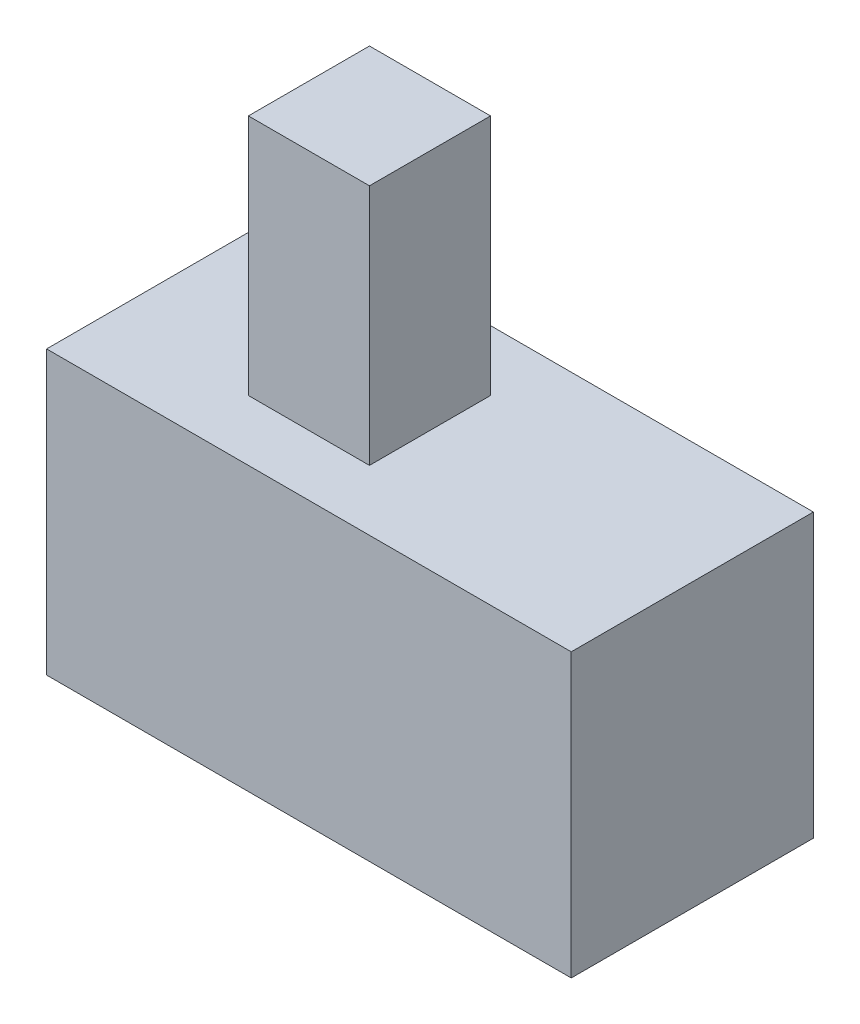
ISO-10303-21;
HEADER;
FILE_DESCRIPTION(('STEP AP214'),'2;1');
FILE_NAME('part.step','',(''),(''),'','','');
FILE_SCHEMA(('AUTOMOTIVE_DESIGN { 1 0 10303 214 1 1 1 1 }'));
ENDSEC;
DATA;
#1=APPLICATION_CONTEXT('core data for automotive mechanical design processes');
#2=APPLICATION_PROTOCOL_DEFINITION('international standard','automotive_design',2000,#1);
#3=PRODUCT_CONTEXT('',#1,'mechanical');
#4=PRODUCT('Part','Part','',(#3));
#5=PRODUCT_RELATED_PRODUCT_CATEGORY('part','',(#4));
#6=PRODUCT_DEFINITION_FORMATION('','',#4);
#7=PRODUCT_DEFINITION_CONTEXT('part definition',#1,'design');
#8=PRODUCT_DEFINITION('design','',#6,#7);
#9=PRODUCT_DEFINITION_SHAPE('','',#8);
#10=(LENGTH_UNIT() NAMED_UNIT(*) SI_UNIT(.MILLI.,.METRE.));
#11=(NAMED_UNIT(*) PLANE_ANGLE_UNIT() SI_UNIT($,.RADIAN.));
#12=(NAMED_UNIT(*) SI_UNIT($,.STERADIAN.) SOLID_ANGLE_UNIT());
#13=UNCERTAINTY_MEASURE_WITH_UNIT(LENGTH_MEASURE(1.E-05),#10,'distance_accuracy_value','');
#14=(GEOMETRIC_REPRESENTATION_CONTEXT(3) GLOBAL_UNCERTAINTY_ASSIGNED_CONTEXT((#13)) GLOBAL_UNIT_ASSIGNED_CONTEXT((#10,
#11,#12)) REPRESENTATION_CONTEXT('',''));
#15=CARTESIAN_POINT('',(0.,0.,0.));
#16=DIRECTION('',(0.,0.,1.));
#17=DIRECTION('',(1.,0.,0.));
#18=AXIS2_PLACEMENT_3D('',#15,#16,#17);
#19=CARTESIAN_POINT('',(-6.5,3.5,6.));
#20=DIRECTION('',(0.,-1.,0.));
#21=DIRECTION('',(0.,0.,-1.));
#22=AXIS2_PLACEMENT_3D('',#19,#20,#21);
#23=PLANE('',#22);
#24=DIRECTION('',(-1.,0.,0.));
#25=VECTOR('',#24,1.);
#26=CARTESIAN_POINT('',(-6.5,3.5,0.));
#27=LINE('',#26,#25);
#28=CARTESIAN_POINT('',(6.5,3.5,0.));
#29=VERTEX_POINT('',#28);
#30=CARTESIAN_POINT('',(-6.5,3.5,0.));
#31=VERTEX_POINT('',#30);
#32=EDGE_CURVE('E131',#29,#31,#27,.T.);
#33=ORIENTED_EDGE('',*,*,#32,.T.);
#34=DIRECTION('',(0.,0.,-1.));
#35=VECTOR('',#34,1.);
#36=CARTESIAN_POINT('',(-6.5,3.5,6.));
#37=LINE('',#36,#35);
#38=CARTESIAN_POINT('',(-6.5,3.5,6.));
#39=VERTEX_POINT('',#38);
#40=EDGE_CURVE('E45',#39,#31,#37,.T.);
#41=ORIENTED_EDGE('',*,*,#40,.F.);
#42=DIRECTION('',(-1.,0.,0.));
#43=VECTOR('',#42,1.);
#44=CARTESIAN_POINT('',(-6.5,3.5,6.));
#45=LINE('',#44,#43);
#46=CARTESIAN_POINT('',(6.5,3.5,6.));
#47=VERTEX_POINT('',#46);
#48=EDGE_CURVE('E142',#47,#39,#45,.T.);
#49=ORIENTED_EDGE('',*,*,#48,.F.);
#50=DIRECTION('',(0.,0.,-1.));
#51=VECTOR('',#50,1.);
#52=CARTESIAN_POINT('',(6.5,3.5,6.));
#53=LINE('',#52,#51);
#54=EDGE_CURVE('E11',#47,#29,#53,.T.);
#55=ORIENTED_EDGE('',*,*,#54,.T.);
#56=EDGE_LOOP('',(#33,#41,#49,#55));
#57=FACE_BOUND('',#56,.T.);
#58=DIRECTION('',(0.,0.,-1.));
#59=VECTOR('',#58,1.);
#60=CARTESIAN_POINT('',(0.,3.5,1.5));
#61=LINE('',#60,#59);
#62=CARTESIAN_POINT('',(0.,3.5,4.5));
#63=VERTEX_POINT('',#62);
#64=CARTESIAN_POINT('',(0.,3.5,1.5));
#65=VERTEX_POINT('',#64);
#66=EDGE_CURVE('E124',#63,#65,#61,.T.);
#67=ORIENTED_EDGE('',*,*,#66,.F.);
#68=DIRECTION('',(1.,0.,0.));
#69=VECTOR('',#68,1.);
#70=CARTESIAN_POINT('',(-3.,3.5,4.5));
#71=LINE('',#70,#69);
#72=CARTESIAN_POINT('',(-3.,3.5,4.5));
#73=VERTEX_POINT('',#72);
#74=EDGE_CURVE('E121',#73,#63,#71,.T.);
#75=ORIENTED_EDGE('',*,*,#74,.F.);
#76=DIRECTION('',(0.,0.,1.));
#77=VECTOR('',#76,1.);
#78=CARTESIAN_POINT('',(-3.,3.5,1.5));
#79=LINE('',#78,#77);
#80=CARTESIAN_POINT('',(-3.,3.5,1.5));
#81=VERTEX_POINT('',#80);
#82=EDGE_CURVE('E57',#81,#73,#79,.T.);
#83=ORIENTED_EDGE('',*,*,#82,.F.);
#84=DIRECTION('',(-1.,0.,0.));
#85=VECTOR('',#84,1.);
#86=CARTESIAN_POINT('',(-3.,3.5,1.5));
#87=LINE('',#86,#85);
#88=EDGE_CURVE('E52',#65,#81,#87,.T.);
#89=ORIENTED_EDGE('',*,*,#88,.F.);
#90=EDGE_LOOP('',(#67,#75,#83,#89));
#91=FACE_BOUND('',#90,.T.);
#92=ADVANCED_FACE('F36',(#57,#91),#23,.F.);
#93=CARTESIAN_POINT('',(6.5,3.5,6.));
#94=DIRECTION('',(-1.,0.,0.));
#95=DIRECTION('',(0.,-1.,0.));
#96=AXIS2_PLACEMENT_3D('',#93,#94,#95);
#97=PLANE('',#96);
#98=DIRECTION('',(0.,1.,0.));
#99=VECTOR('',#98,1.);
#100=CARTESIAN_POINT('',(6.5,3.5,0.));
#101=LINE('',#100,#99);
#102=CARTESIAN_POINT('',(6.5,-3.5,0.));
#103=VERTEX_POINT('',#102);
#104=EDGE_CURVE('E126',#103,#29,#101,.T.);
#105=ORIENTED_EDGE('',*,*,#104,.T.);
#106=ORIENTED_EDGE('',*,*,#54,.F.);
#107=DIRECTION('',(0.,1.,0.));
#108=VECTOR('',#107,1.);
#109=CARTESIAN_POINT('',(6.5,3.5,6.));
#110=LINE('',#109,#108);
#111=CARTESIAN_POINT('',(6.5,-3.5,6.));
#112=VERTEX_POINT('',#111);
#113=EDGE_CURVE('E138',#112,#47,#110,.T.);
#114=ORIENTED_EDGE('',*,*,#113,.F.);
#115=DIRECTION('',(0.,0.,-1.));
#116=VECTOR('',#115,1.);
#117=CARTESIAN_POINT('',(6.5,-3.5,6.));
#118=LINE('',#117,#116);
#119=EDGE_CURVE('E151',#112,#103,#118,.T.);
#120=ORIENTED_EDGE('',*,*,#119,.T.);
#121=EDGE_LOOP('',(#105,#106,#114,#120));
#122=FACE_BOUND('',#121,.T.);
#123=ADVANCED_FACE('F38',(#122),#97,.F.);
#124=CARTESIAN_POINT('',(-6.5,3.5,6.));
#125=DIRECTION('',(1.,0.,0.));
#126=DIRECTION('',(0.,1.,0.));
#127=AXIS2_PLACEMENT_3D('',#124,#125,#126);
#128=PLANE('',#127);
#129=DIRECTION('',(0.,-1.,0.));
#130=VECTOR('',#129,1.);
#131=CARTESIAN_POINT('',(-6.5,3.5,0.));
#132=LINE('',#131,#130);
#133=CARTESIAN_POINT('',(-6.5,-3.5,0.));
#134=VERTEX_POINT('',#133);
#135=EDGE_CURVE('E155',#31,#134,#132,.T.);
#136=ORIENTED_EDGE('',*,*,#135,.T.);
#137=DIRECTION('',(0.,0.,-1.));
#138=VECTOR('',#137,1.);
#139=CARTESIAN_POINT('',(-6.5,-3.5,6.));
#140=LINE('',#139,#138);
#141=CARTESIAN_POINT('',(-6.5,-3.5,6.));
#142=VERTEX_POINT('',#141);
#143=EDGE_CURVE('E163',#142,#134,#140,.T.);
#144=ORIENTED_EDGE('',*,*,#143,.F.);
#145=DIRECTION('',(0.,-1.,0.));
#146=VECTOR('',#145,1.);
#147=CARTESIAN_POINT('',(-6.5,3.5,6.));
#148=LINE('',#147,#146);
#149=EDGE_CURVE('E146',#39,#142,#148,.T.);
#150=ORIENTED_EDGE('',*,*,#149,.F.);
#151=ORIENTED_EDGE('',*,*,#40,.T.);
#152=EDGE_LOOP('',(#136,#144,#150,#151));
#153=FACE_BOUND('',#152,.T.);
#154=ADVANCED_FACE('F172',(#153),#128,.F.);
#155=CARTESIAN_POINT('',(-6.5,-3.5,6.));
#156=DIRECTION('',(0.,1.,0.));
#157=DIRECTION('',(0.,0.,1.));
#158=AXIS2_PLACEMENT_3D('',#155,#156,#157);
#159=PLANE('',#158);
#160=DIRECTION('',(1.,0.,0.));
#161=VECTOR('',#160,1.);
#162=CARTESIAN_POINT('',(-6.5,-3.5,0.));
#163=LINE('',#162,#161);
#164=EDGE_CURVE('E143',#134,#103,#163,.T.);
#165=ORIENTED_EDGE('',*,*,#164,.T.);
#166=ORIENTED_EDGE('',*,*,#119,.F.);
#167=DIRECTION('',(1.,0.,0.));
#168=VECTOR('',#167,1.);
#169=CARTESIAN_POINT('',(-6.5,-3.5,6.));
#170=LINE('',#169,#168);
#171=EDGE_CURVE('E149',#142,#112,#170,.T.);
#172=ORIENTED_EDGE('',*,*,#171,.F.);
#173=ORIENTED_EDGE('',*,*,#143,.T.);
#174=EDGE_LOOP('',(#165,#166,#172,#173));
#175=FACE_BOUND('',#174,.T.);
#176=ADVANCED_FACE('F181',(#175),#159,.F.);
#177=CARTESIAN_POINT('',(0.,0.,6.));
#178=DIRECTION('',(0.,0.,1.));
#179=DIRECTION('',(1.,0.,0.));
#180=AXIS2_PLACEMENT_3D('',#177,#178,#179);
#181=PLANE('',#180);
#182=ORIENTED_EDGE('',*,*,#113,.T.);
#183=ORIENTED_EDGE('',*,*,#48,.T.);
#184=ORIENTED_EDGE('',*,*,#149,.T.);
#185=ORIENTED_EDGE('',*,*,#171,.T.);
#186=EDGE_LOOP('',(#182,#183,#184,#185));
#187=FACE_BOUND('',#186,.T.);
#188=ADVANCED_FACE('F187',(#187),#181,.T.);
#189=CARTESIAN_POINT('',(0.,0.,0.));
#190=DIRECTION('',(0.,0.,1.));
#191=DIRECTION('',(1.,0.,0.));
#192=AXIS2_PLACEMENT_3D('',#189,#190,#191);
#193=PLANE('',#192);
#194=ORIENTED_EDGE('',*,*,#104,.F.);
#195=ORIENTED_EDGE('',*,*,#164,.F.);
#196=ORIENTED_EDGE('',*,*,#135,.F.);
#197=ORIENTED_EDGE('',*,*,#32,.F.);
#198=EDGE_LOOP('',(#194,#195,#196,#197));
#199=FACE_BOUND('',#198,.T.);
#200=ADVANCED_FACE('F178',(#199),#193,.F.);
#201=CARTESIAN_POINT('',(0.,9.5,1.5));
#202=DIRECTION('',(-1.,0.,0.));
#203=DIRECTION('',(0.,0.,1.));
#204=AXIS2_PLACEMENT_3D('',#201,#202,#203);
#205=PLANE('',#204);
#206=ORIENTED_EDGE('',*,*,#66,.T.);
#207=DIRECTION('',(0.,-1.,0.));
#208=VECTOR('',#207,1.);
#209=CARTESIAN_POINT('',(0.,9.5,1.5));
#210=LINE('',#209,#208);
#211=CARTESIAN_POINT('',(0.,9.5,1.5));
#212=VERTEX_POINT('',#211);
#213=EDGE_CURVE('E103',#212,#65,#210,.T.);
#214=ORIENTED_EDGE('',*,*,#213,.F.);
#215=DIRECTION('',(0.,0.,-1.));
#216=VECTOR('',#215,1.);
#217=CARTESIAN_POINT('',(0.,9.5,1.5));
#218=LINE('',#217,#216);
#219=CARTESIAN_POINT('',(0.,9.5,4.5));
#220=VERTEX_POINT('',#219);
#221=EDGE_CURVE('E111',#220,#212,#218,.T.);
#222=ORIENTED_EDGE('',*,*,#221,.F.);
#223=DIRECTION('',(0.,-1.,0.));
#224=VECTOR('',#223,1.);
#225=CARTESIAN_POINT('',(0.,9.5,4.5));
#226=LINE('',#225,#224);
#227=EDGE_CURVE('E195',#220,#63,#226,.T.);
#228=ORIENTED_EDGE('',*,*,#227,.T.);
#229=EDGE_LOOP('',(#206,#214,#222,#228));
#230=FACE_BOUND('',#229,.T.);
#231=ADVANCED_FACE('F123',(#230),#205,.F.);
#232=CARTESIAN_POINT('',(-3.,9.5,1.5));
#233=DIRECTION('',(0.,0.,1.));
#234=DIRECTION('',(1.,0.,0.));
#235=AXIS2_PLACEMENT_3D('',#232,#233,#234);
#236=PLANE('',#235);
#237=ORIENTED_EDGE('',*,*,#88,.T.);
#238=DIRECTION('',(0.,-1.,0.));
#239=VECTOR('',#238,1.);
#240=CARTESIAN_POINT('',(-3.,9.5,1.5));
#241=LINE('',#240,#239);
#242=CARTESIAN_POINT('',(-3.,9.5,1.5));
#243=VERTEX_POINT('',#242);
#244=EDGE_CURVE('E106',#243,#81,#241,.T.);
#245=ORIENTED_EDGE('',*,*,#244,.F.);
#246=DIRECTION('',(-1.,0.,0.));
#247=VECTOR('',#246,1.);
#248=CARTESIAN_POINT('',(-3.,9.5,1.5));
#249=LINE('',#248,#247);
#250=EDGE_CURVE('E99',#212,#243,#249,.T.);
#251=ORIENTED_EDGE('',*,*,#250,.F.);
#252=ORIENTED_EDGE('',*,*,#213,.T.);
#253=EDGE_LOOP('',(#237,#245,#251,#252));
#254=FACE_BOUND('',#253,.T.);
#255=ADVANCED_FACE('F101',(#254),#236,.F.);
#256=CARTESIAN_POINT('',(-3.,9.5,1.5));
#257=DIRECTION('',(1.,0.,0.));
#258=DIRECTION('',(0.,0.,-1.));
#259=AXIS2_PLACEMENT_3D('',#256,#257,#258);
#260=PLANE('',#259);
#261=ORIENTED_EDGE('',*,*,#82,.T.);
#262=DIRECTION('',(0.,-1.,0.));
#263=VECTOR('',#262,1.);
#264=CARTESIAN_POINT('',(-3.,9.5,4.5));
#265=LINE('',#264,#263);
#266=CARTESIAN_POINT('',(-3.,9.5,4.5));
#267=VERTEX_POINT('',#266);
#268=EDGE_CURVE('E134',#267,#73,#265,.T.);
#269=ORIENTED_EDGE('',*,*,#268,.F.);
#270=DIRECTION('',(0.,0.,1.));
#271=VECTOR('',#270,1.);
#272=CARTESIAN_POINT('',(-3.,9.5,1.5));
#273=LINE('',#272,#271);
#274=EDGE_CURVE('E110',#243,#267,#273,.T.);
#275=ORIENTED_EDGE('',*,*,#274,.F.);
#276=ORIENTED_EDGE('',*,*,#244,.T.);
#277=EDGE_LOOP('',(#261,#269,#275,#276));
#278=FACE_BOUND('',#277,.T.);
#279=ADVANCED_FACE('F210',(#278),#260,.F.);
#280=CARTESIAN_POINT('',(-3.,9.5,4.5));
#281=DIRECTION('',(0.,0.,-1.));
#282=DIRECTION('',(-1.,0.,0.));
#283=AXIS2_PLACEMENT_3D('',#280,#281,#282);
#284=PLANE('',#283);
#285=ORIENTED_EDGE('',*,*,#74,.T.);
#286=ORIENTED_EDGE('',*,*,#227,.F.);
#287=DIRECTION('',(1.,0.,0.));
#288=VECTOR('',#287,1.);
#289=CARTESIAN_POINT('',(-3.,9.5,4.5));
#290=LINE('',#289,#288);
#291=EDGE_CURVE('E116',#267,#220,#290,.T.);
#292=ORIENTED_EDGE('',*,*,#291,.F.);
#293=ORIENTED_EDGE('',*,*,#268,.T.);
#294=EDGE_LOOP('',(#285,#286,#292,#293));
#295=FACE_BOUND('',#294,.T.);
#296=ADVANCED_FACE('F194',(#295),#284,.F.);
#297=CARTESIAN_POINT('',(0.,9.5,0.));
#298=DIRECTION('',(0.,1.,0.));
#299=DIRECTION('',(0.,0.,1.));
#300=AXIS2_PLACEMENT_3D('',#297,#298,#299);
#301=PLANE('',#300);
#302=ORIENTED_EDGE('',*,*,#221,.T.);
#303=ORIENTED_EDGE('',*,*,#250,.T.);
#304=ORIENTED_EDGE('',*,*,#274,.T.);
#305=ORIENTED_EDGE('',*,*,#291,.T.);
#306=EDGE_LOOP('',(#302,#303,#304,#305));
#307=FACE_BOUND('',#306,.T.);
#308=ADVANCED_FACE('F114',(#307),#301,.T.);
#309=CLOSED_SHELL('',(#92,#123,#154,#176,#188,#200,#231,#255,#279,#296,#308));
#310=MANIFOLD_SOLID_BREP('B2',#309);
#311=ADVANCED_BREP_SHAPE_REPRESENTATION('',(#18,#310),#14);
#312=SHAPE_DEFINITION_REPRESENTATION(#9,#311);
ENDSEC;
END-ISO-10303-21;
